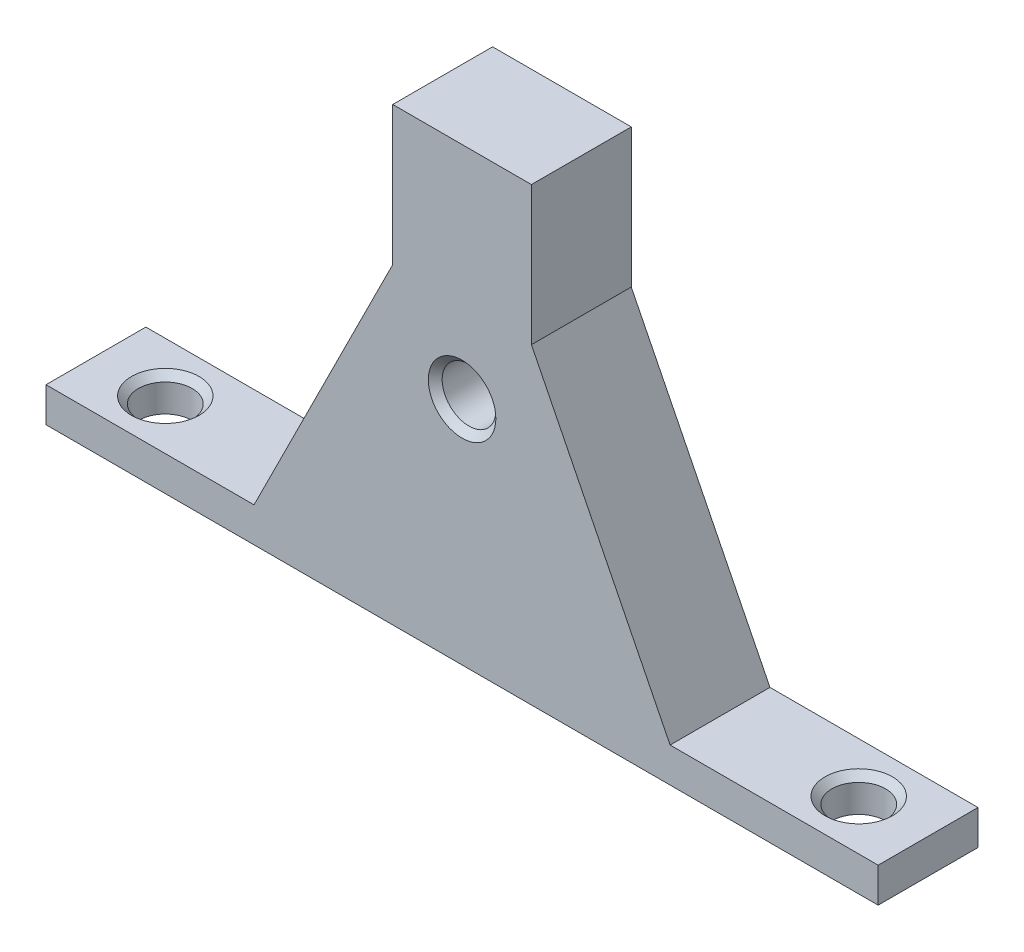
ISO-10303-21;
HEADER;
FILE_DESCRIPTION(('STEP AP214'),'2;1');
FILE_NAME('part.step','',(''),(''),'','','');
FILE_SCHEMA(('AUTOMOTIVE_DESIGN { 1 0 10303 214 1 1 1 1 }'));
ENDSEC;
DATA;
#1=APPLICATION_CONTEXT('core data for automotive mechanical design processes');
#2=APPLICATION_PROTOCOL_DEFINITION('international standard','automotive_design',2000,#1);
#3=PRODUCT_CONTEXT('',#1,'mechanical');
#4=PRODUCT('Part','Part','',(#3));
#5=PRODUCT_RELATED_PRODUCT_CATEGORY('part','',(#4));
#6=PRODUCT_DEFINITION_FORMATION('','',#4);
#7=PRODUCT_DEFINITION_CONTEXT('part definition',#1,'design');
#8=PRODUCT_DEFINITION('design','',#6,#7);
#9=PRODUCT_DEFINITION_SHAPE('','',#8);
#10=(LENGTH_UNIT() NAMED_UNIT(*) SI_UNIT(.MILLI.,.METRE.));
#11=(NAMED_UNIT(*) PLANE_ANGLE_UNIT() SI_UNIT($,.RADIAN.));
#12=(NAMED_UNIT(*) SI_UNIT($,.STERADIAN.) SOLID_ANGLE_UNIT());
#13=UNCERTAINTY_MEASURE_WITH_UNIT(LENGTH_MEASURE(1.E-05),#10,'distance_accuracy_value','');
#14=(GEOMETRIC_REPRESENTATION_CONTEXT(3) GLOBAL_UNCERTAINTY_ASSIGNED_CONTEXT((#13)) GLOBAL_UNIT_ASSIGNED_CONTEXT((#10,
#11,#12)) REPRESENTATION_CONTEXT('',''));
#15=CARTESIAN_POINT('',(0.,0.,0.));
#16=DIRECTION('',(0.,0.,1.));
#17=DIRECTION('',(1.,0.,0.));
#18=AXIS2_PLACEMENT_3D('',#15,#16,#17);
#19=CARTESIAN_POINT('',(0.,3.175,0.));
#20=DIRECTION('',(0.,-1.,0.));
#21=DIRECTION('',(0.,0.,-1.));
#22=AXIS2_PLACEMENT_3D('',#19,#20,#21);
#23=PLANE('',#22);
#24=CARTESIAN_POINT('',(-31.75,3.175,0.));
#25=DIRECTION('',(0.,1.,0.));
#26=DIRECTION('',(0.,0.,1.));
#27=AXIS2_PLACEMENT_3D('',#24,#25,#26);
#28=CIRCLE('',#27,3.09245);
#29=CARTESIAN_POINT('',(-31.75,3.175,3.09245));
#30=VERTEX_POINT('',#29);
#31=EDGE_CURVE('E187',#30,#30,#28,.T.);
#32=ORIENTED_EDGE('',*,*,#31,.F.);
#33=EDGE_LOOP('',(#32));
#34=FACE_BOUND('',#33,.T.);
#35=DIRECTION('',(0.,0.,1.));
#36=VECTOR('',#35,1.);
#37=CARTESIAN_POINT('',(-19.05,3.175,-58.453536726415));
#38=LINE('',#37,#36);
#39=CARTESIAN_POINT('',(-19.05,3.175,-4.572));
#40=VERTEX_POINT('',#39);
#41=CARTESIAN_POINT('',(-19.05,3.175,4.572));
#42=VERTEX_POINT('',#41);
#43=EDGE_CURVE('E171',#40,#42,#38,.T.);
#44=ORIENTED_EDGE('',*,*,#43,.F.);
#45=DIRECTION('',(-1.,0.,0.));
#46=VECTOR('',#45,1.);
#47=CARTESIAN_POINT('',(-38.1,3.175,-4.572));
#48=LINE('',#47,#46);
#49=CARTESIAN_POINT('',(-38.1,3.175,-4.572));
#50=VERTEX_POINT('',#49);
#51=EDGE_CURVE('E215',#40,#50,#48,.T.);
#52=ORIENTED_EDGE('',*,*,#51,.T.);
#53=DIRECTION('',(0.,0.,1.));
#54=VECTOR('',#53,1.);
#55=CARTESIAN_POINT('',(-38.1,3.175,4.572));
#56=LINE('',#55,#54);
#57=CARTESIAN_POINT('',(-38.1,3.175,4.572));
#58=VERTEX_POINT('',#57);
#59=EDGE_CURVE('E218',#50,#58,#56,.T.);
#60=ORIENTED_EDGE('',*,*,#59,.T.);
#61=DIRECTION('',(1.,0.,0.));
#62=VECTOR('',#61,1.);
#63=CARTESIAN_POINT('',(-38.1,3.175,4.572));
#64=LINE('',#63,#62);
#65=EDGE_CURVE('E221',#58,#42,#64,.T.);
#66=ORIENTED_EDGE('',*,*,#65,.T.);
#67=EDGE_LOOP('',(#44,#52,#60,#66));
#68=FACE_BOUND('',#67,.T.);
#69=ADVANCED_FACE('F42',(#34,#68),#23,.F.);
#70=CARTESIAN_POINT('',(38.1,3.175,4.572));
#71=DIRECTION('',(-1.,0.,0.));
#72=DIRECTION('',(0.,0.,1.));
#73=AXIS2_PLACEMENT_3D('',#70,#71,#72);
#74=PLANE('',#73);
#75=DIRECTION('',(0.,0.,-1.));
#76=VECTOR('',#75,1.);
#77=CARTESIAN_POINT('',(38.1,0.,4.572));
#78=LINE('',#77,#76);
#79=CARTESIAN_POINT('',(38.1,0.,4.572));
#80=VERTEX_POINT('',#79);
#81=CARTESIAN_POINT('',(38.1,0.,-4.572));
#82=VERTEX_POINT('',#81);
#83=EDGE_CURVE('E211',#80,#82,#78,.T.);
#84=ORIENTED_EDGE('',*,*,#83,.T.);
#85=DIRECTION('',(0.,-1.,0.));
#86=VECTOR('',#85,1.);
#87=CARTESIAN_POINT('',(38.1,3.175,-4.572));
#88=LINE('',#87,#86);
#89=CARTESIAN_POINT('',(38.1,3.175,-4.572));
#90=VERTEX_POINT('',#89);
#91=EDGE_CURVE('E11',#90,#82,#88,.T.);
#92=ORIENTED_EDGE('',*,*,#91,.F.);
#93=DIRECTION('',(0.,0.,-1.));
#94=VECTOR('',#93,1.);
#95=CARTESIAN_POINT('',(38.1,3.175,4.572));
#96=LINE('',#95,#94);
#97=CARTESIAN_POINT('',(38.1,3.175,4.572));
#98=VERTEX_POINT('',#97);
#99=EDGE_CURVE('E212',#98,#90,#96,.T.);
#100=ORIENTED_EDGE('',*,*,#99,.F.);
#101=DIRECTION('',(0.,-1.,0.));
#102=VECTOR('',#101,1.);
#103=CARTESIAN_POINT('',(38.1,3.175,4.572));
#104=LINE('',#103,#102);
#105=EDGE_CURVE('E225',#98,#80,#104,.T.);
#106=ORIENTED_EDGE('',*,*,#105,.T.);
#107=EDGE_LOOP('',(#84,#92,#100,#106));
#108=FACE_BOUND('',#107,.T.);
#109=ADVANCED_FACE('F44',(#108),#74,.F.);
#110=CARTESIAN_POINT('',(-38.1,3.175,-4.572));
#111=DIRECTION('',(0.,0.,1.));
#112=DIRECTION('',(1.,0.,0.));
#113=AXIS2_PLACEMENT_3D('',#110,#111,#112);
#114=PLANE('',#113);
#115=CARTESIAN_POINT('',(0.,21.082,-4.572));
#116=DIRECTION('',(0.,0.,1.));
#117=DIRECTION('',(1.,0.,0.));
#118=AXIS2_PLACEMENT_3D('',#115,#116,#117);
#119=CIRCLE('',#118,2.45745);
#120=CARTESIAN_POINT('',(2.45745,21.082,-4.572));
#121=VERTEX_POINT('',#120);
#122=EDGE_CURVE('E150',#121,#121,#119,.T.);
#123=ORIENTED_EDGE('',*,*,#122,.T.);
#124=EDGE_LOOP('',(#123));
#125=FACE_BOUND('',#124,.T.);
#126=DIRECTION('',(-1.,0.,0.));
#127=VECTOR('',#126,1.);
#128=CARTESIAN_POINT('',(-38.1,0.,-4.572));
#129=LINE('',#128,#127);
#130=CARTESIAN_POINT('',(-38.1,0.,-4.572));
#131=VERTEX_POINT('',#130);
#132=EDGE_CURVE('E229',#82,#131,#129,.T.);
#133=ORIENTED_EDGE('',*,*,#132,.T.);
#134=DIRECTION('',(0.,-1.,0.));
#135=VECTOR('',#134,1.);
#136=CARTESIAN_POINT('',(-38.1,3.175,-4.572));
#137=LINE('',#136,#135);
#138=EDGE_CURVE('E51',#50,#131,#137,.T.);
#139=ORIENTED_EDGE('',*,*,#138,.F.);
#140=ORIENTED_EDGE('',*,*,#51,.F.);
#141=DIRECTION('',(-0.447213595499958,-0.894427190999916,0.));
#142=VECTOR('',#141,1.);
#143=CARTESIAN_POINT('',(-16.51,8.255,-4.572));
#144=LINE('',#143,#142);
#145=CARTESIAN_POINT('',(-6.35,28.575,-4.572));
#146=VERTEX_POINT('',#145);
#147=EDGE_CURVE('E158',#146,#40,#144,.T.);
#148=ORIENTED_EDGE('',*,*,#147,.F.);
#149=DIRECTION('',(0.,-1.,0.));
#150=VECTOR('',#149,1.);
#151=CARTESIAN_POINT('',(-6.35,0.,-4.572));
#152=LINE('',#151,#150);
#153=CARTESIAN_POINT('',(-6.35,41.275,-4.572));
#154=VERTEX_POINT('',#153);
#155=EDGE_CURVE('E303',#154,#146,#152,.T.);
#156=ORIENTED_EDGE('',*,*,#155,.F.);
#157=DIRECTION('',(-1.,0.,0.));
#158=VECTOR('',#157,1.);
#159=CARTESIAN_POINT('',(0.,41.275,-4.572));
#160=LINE('',#159,#158);
#161=CARTESIAN_POINT('',(6.35,41.275,-4.572));
#162=VERTEX_POINT('',#161);
#163=EDGE_CURVE('E306',#162,#154,#160,.T.);
#164=ORIENTED_EDGE('',*,*,#163,.F.);
#165=DIRECTION('',(0.,-1.,0.));
#166=VECTOR('',#165,1.);
#167=CARTESIAN_POINT('',(6.35000000000004,0.,-4.572));
#168=LINE('',#167,#166);
#169=CARTESIAN_POINT('',(6.35000000000001,28.575,-4.572));
#170=VERTEX_POINT('',#169);
#171=EDGE_CURVE('E174',#162,#170,#168,.T.);
#172=ORIENTED_EDGE('',*,*,#171,.T.);
#173=DIRECTION('',(0.447213595499959,-0.894427190999915,0.));
#174=VECTOR('',#173,1.);
#175=CARTESIAN_POINT('',(16.51,8.25500000000003,-4.572));
#176=LINE('',#175,#174);
#177=CARTESIAN_POINT('',(19.0500000000001,3.175,-4.572));
#178=VERTEX_POINT('',#177);
#179=EDGE_CURVE('E132',#170,#178,#176,.T.);
#180=ORIENTED_EDGE('',*,*,#179,.T.);
#181=EDGE_CURVE('E95',#90,#178,#48,.T.);
#182=ORIENTED_EDGE('',*,*,#181,.F.);
#183=ORIENTED_EDGE('',*,*,#91,.T.);
#184=EDGE_LOOP('',(#133,#139,#140,#148,#156,#164,#172,#180,#182,#183));
#185=FACE_BOUND('',#184,.T.);
#186=ADVANCED_FACE('F277',(#125,#185),#114,.F.);
#187=CARTESIAN_POINT('',(-38.1,3.175,4.572));
#188=DIRECTION('',(1.,0.,0.));
#189=DIRECTION('',(0.,0.,-1.));
#190=AXIS2_PLACEMENT_3D('',#187,#188,#189);
#191=PLANE('',#190);
#192=DIRECTION('',(0.,0.,1.));
#193=VECTOR('',#192,1.);
#194=CARTESIAN_POINT('',(-38.1,0.,4.572));
#195=LINE('',#194,#193);
#196=CARTESIAN_POINT('',(-38.1,0.,4.572));
#197=VERTEX_POINT('',#196);
#198=EDGE_CURVE('E232',#131,#197,#195,.T.);
#199=ORIENTED_EDGE('',*,*,#198,.T.);
#200=DIRECTION('',(0.,-1.,0.));
#201=VECTOR('',#200,1.);
#202=CARTESIAN_POINT('',(-38.1,3.175,4.572));
#203=LINE('',#202,#201);
#204=EDGE_CURVE('E239',#58,#197,#203,.T.);
#205=ORIENTED_EDGE('',*,*,#204,.F.);
#206=ORIENTED_EDGE('',*,*,#59,.F.);
#207=ORIENTED_EDGE('',*,*,#138,.T.);
#208=EDGE_LOOP('',(#199,#205,#206,#207));
#209=FACE_BOUND('',#208,.T.);
#210=ADVANCED_FACE('F248',(#209),#191,.F.);
#211=CARTESIAN_POINT('',(-38.1,3.175,4.572));
#212=DIRECTION('',(0.,0.,-1.));
#213=DIRECTION('',(-1.,0.,0.));
#214=AXIS2_PLACEMENT_3D('',#211,#212,#213);
#215=PLANE('',#214);
#216=CARTESIAN_POINT('',(0.,21.082,4.572));
#217=DIRECTION('',(0.,0.,1.));
#218=DIRECTION('',(1.,0.,0.));
#219=AXIS2_PLACEMENT_3D('',#216,#217,#218);
#220=CIRCLE('',#219,3.09245);
#221=CARTESIAN_POINT('',(3.09245,21.082,4.572));
#222=VERTEX_POINT('',#221);
#223=EDGE_CURVE('E327',#222,#222,#220,.T.);
#224=ORIENTED_EDGE('',*,*,#223,.F.);
#225=EDGE_LOOP('',(#224));
#226=FACE_BOUND('',#225,.T.);
#227=DIRECTION('',(1.,0.,0.));
#228=VECTOR('',#227,1.);
#229=CARTESIAN_POINT('',(-38.1,0.,4.572));
#230=LINE('',#229,#228);
#231=EDGE_CURVE('E88',#197,#80,#230,.T.);
#232=ORIENTED_EDGE('',*,*,#231,.T.);
#233=ORIENTED_EDGE('',*,*,#105,.F.);
#234=CARTESIAN_POINT('',(19.05,3.175,4.572));
#235=VERTEX_POINT('',#234);
#236=EDGE_CURVE('E66',#235,#98,#64,.T.);
#237=ORIENTED_EDGE('',*,*,#236,.F.);
#238=DIRECTION('',(-0.447213595499959,0.894427190999915,0.));
#239=VECTOR('',#238,1.);
#240=CARTESIAN_POINT('',(16.51,8.25500000000003,4.572));
#241=LINE('',#240,#239);
#242=CARTESIAN_POINT('',(6.35000000000001,28.575,4.572));
#243=VERTEX_POINT('',#242);
#244=EDGE_CURVE('E58',#235,#243,#241,.T.);
#245=ORIENTED_EDGE('',*,*,#244,.T.);
#246=DIRECTION('',(0.,1.,0.));
#247=VECTOR('',#246,1.);
#248=CARTESIAN_POINT('',(6.35000000000004,0.,4.572));
#249=LINE('',#248,#247);
#250=CARTESIAN_POINT('',(6.35,41.275,4.572));
#251=VERTEX_POINT('',#250);
#252=EDGE_CURVE('E140',#243,#251,#249,.T.);
#253=ORIENTED_EDGE('',*,*,#252,.T.);
#254=DIRECTION('',(1.,0.,0.));
#255=VECTOR('',#254,1.);
#256=CARTESIAN_POINT('',(0.,41.275,4.572));
#257=LINE('',#256,#255);
#258=CARTESIAN_POINT('',(-6.35,41.275,4.572));
#259=VERTEX_POINT('',#258);
#260=EDGE_CURVE('E146',#259,#251,#257,.T.);
#261=ORIENTED_EDGE('',*,*,#260,.F.);
#262=DIRECTION('',(0.,1.,0.));
#263=VECTOR('',#262,1.);
#264=CARTESIAN_POINT('',(-6.35,0.,4.572));
#265=LINE('',#264,#263);
#266=CARTESIAN_POINT('',(-6.35,28.575,4.572));
#267=VERTEX_POINT('',#266);
#268=EDGE_CURVE('E163',#267,#259,#265,.T.);
#269=ORIENTED_EDGE('',*,*,#268,.F.);
#270=DIRECTION('',(0.447213595499958,0.894427190999916,0.));
#271=VECTOR('',#270,1.);
#272=CARTESIAN_POINT('',(-16.51,8.255,4.572));
#273=LINE('',#272,#271);
#274=EDGE_CURVE('E167',#42,#267,#273,.T.);
#275=ORIENTED_EDGE('',*,*,#274,.F.);
#276=ORIENTED_EDGE('',*,*,#65,.F.);
#277=ORIENTED_EDGE('',*,*,#204,.T.);
#278=EDGE_LOOP('',(#232,#233,#237,#245,#253,#261,#269,#275,#276,#277));
#279=FACE_BOUND('',#278,.T.);
#280=ADVANCED_FACE('F148',(#226,#279),#215,.F.);
#281=CARTESIAN_POINT('',(31.75,3.175,0.));
#282=DIRECTION('',(0.,1.,0.));
#283=DIRECTION('',(0.,0.,1.));
#284=AXIS2_PLACEMENT_3D('',#281,#282,#283);
#285=CIRCLE('',#284,3.09245);
#286=CARTESIAN_POINT('',(31.75,3.175,3.09245));
#287=VERTEX_POINT('',#286);
#288=EDGE_CURVE('E199',#287,#287,#285,.T.);
#289=ORIENTED_EDGE('',*,*,#288,.F.);
#290=EDGE_LOOP('',(#289));
#291=FACE_BOUND('',#290,.T.);
#292=ORIENTED_EDGE('',*,*,#181,.T.);
#293=DIRECTION('',(0.,0.,1.));
#294=VECTOR('',#293,1.);
#295=CARTESIAN_POINT('',(19.0500000000001,3.175,-58.453536726415));
#296=LINE('',#295,#294);
#297=EDGE_CURVE('E137',#178,#235,#296,.T.);
#298=ORIENTED_EDGE('',*,*,#297,.T.);
#299=ORIENTED_EDGE('',*,*,#236,.T.);
#300=ORIENTED_EDGE('',*,*,#99,.T.);
#301=EDGE_LOOP('',(#292,#298,#299,#300));
#302=FACE_BOUND('',#301,.T.);
#303=ADVANCED_FACE('F257',(#291,#302),#23,.F.);
#304=CARTESIAN_POINT('',(0.,0.,0.));
#305=DIRECTION('',(0.,-1.,0.));
#306=DIRECTION('',(0.,0.,-1.));
#307=AXIS2_PLACEMENT_3D('',#304,#305,#306);
#308=PLANE('',#307);
#309=CARTESIAN_POINT('',(-31.75,0.,0.));
#310=DIRECTION('',(0.,1.,0.));
#311=DIRECTION('',(0.,0.,1.));
#312=AXIS2_PLACEMENT_3D('',#309,#310,#311);
#313=CIRCLE('',#312,2.45745);
#314=CARTESIAN_POINT('',(-31.75,0.,2.45745));
#315=VERTEX_POINT('',#314);
#316=EDGE_CURVE('E195',#315,#315,#313,.T.);
#317=ORIENTED_EDGE('',*,*,#316,.T.);
#318=EDGE_LOOP('',(#317));
#319=FACE_BOUND('',#318,.T.);
#320=CARTESIAN_POINT('',(31.75,0.,0.));
#321=DIRECTION('',(0.,1.,0.));
#322=DIRECTION('',(0.,0.,1.));
#323=AXIS2_PLACEMENT_3D('',#320,#321,#322);
#324=CIRCLE('',#323,2.45745);
#325=CARTESIAN_POINT('',(31.75,0.,2.45745));
#326=VERTEX_POINT('',#325);
#327=EDGE_CURVE('E207',#326,#326,#324,.T.);
#328=ORIENTED_EDGE('',*,*,#327,.T.);
#329=EDGE_LOOP('',(#328));
#330=FACE_BOUND('',#329,.T.);
#331=ORIENTED_EDGE('',*,*,#83,.F.);
#332=ORIENTED_EDGE('',*,*,#231,.F.);
#333=ORIENTED_EDGE('',*,*,#198,.F.);
#334=ORIENTED_EDGE('',*,*,#132,.F.);
#335=EDGE_LOOP('',(#331,#332,#333,#334));
#336=FACE_BOUND('',#335,.T.);
#337=ADVANCED_FACE('F253',(#319,#330,#336),#308,.T.);
#338=CARTESIAN_POINT('',(31.75,3.175,0.));
#339=DIRECTION('',(0.,1.,0.));
#340=DIRECTION('',(0.,0.,1.));
#341=AXIS2_PLACEMENT_3D('',#338,#339,#340);
#342=CYLINDRICAL_SURFACE('',#341,2.45744999999999);
#343=ORIENTED_EDGE('',*,*,#327,.F.);
#344=EDGE_LOOP('',(#343));
#345=FACE_BOUND('',#344,.T.);
#346=CARTESIAN_POINT('',(31.75,2.53999999999999,0.));
#347=DIRECTION('',(0.,1.,0.));
#348=DIRECTION('',(0.,0.,1.));
#349=AXIS2_PLACEMENT_3D('',#346,#347,#348);
#350=CIRCLE('',#349,2.45744999999999);
#351=CARTESIAN_POINT('',(31.75,2.53999999999999,2.45744999999999));
#352=VERTEX_POINT('',#351);
#353=EDGE_CURVE('E203',#352,#352,#350,.T.);
#354=ORIENTED_EDGE('',*,*,#353,.T.);
#355=EDGE_LOOP('',(#354));
#356=FACE_BOUND('',#355,.T.);
#357=ADVANCED_FACE('F265',(#345,#356),#342,.F.);
#358=CARTESIAN_POINT('',(31.75,3.175,0.));
#359=DIRECTION('',(0.,1.,0.));
#360=DIRECTION('',(0.,0.,1.));
#361=AXIS2_PLACEMENT_3D('',#358,#359,#360);
#362=CONICAL_SURFACE('',#361,3.09245,0.785398163397447);
#363=ORIENTED_EDGE('',*,*,#353,.F.);
#364=EDGE_LOOP('',(#363));
#365=FACE_BOUND('',#364,.T.);
#366=ORIENTED_EDGE('',*,*,#288,.T.);
#367=EDGE_LOOP('',(#366));
#368=FACE_BOUND('',#367,.T.);
#369=ADVANCED_FACE('F367',(#365,#368),#362,.F.);
#370=CARTESIAN_POINT('',(-31.75,3.175,0.));
#371=DIRECTION('',(0.,1.,0.));
#372=DIRECTION('',(0.,0.,1.));
#373=AXIS2_PLACEMENT_3D('',#370,#371,#372);
#374=CYLINDRICAL_SURFACE('',#373,2.45744999999999);
#375=ORIENTED_EDGE('',*,*,#316,.F.);
#376=EDGE_LOOP('',(#375));
#377=FACE_BOUND('',#376,.T.);
#378=CARTESIAN_POINT('',(-31.75,2.53999999999999,0.));
#379=DIRECTION('',(0.,1.,0.));
#380=DIRECTION('',(0.,0.,1.));
#381=AXIS2_PLACEMENT_3D('',#378,#379,#380);
#382=CIRCLE('',#381,2.45744999999999);
#383=CARTESIAN_POINT('',(-31.75,2.53999999999999,2.45744999999999));
#384=VERTEX_POINT('',#383);
#385=EDGE_CURVE('E191',#384,#384,#382,.T.);
#386=ORIENTED_EDGE('',*,*,#385,.T.);
#387=EDGE_LOOP('',(#386));
#388=FACE_BOUND('',#387,.T.);
#389=ADVANCED_FACE('F363',(#377,#388),#374,.F.);
#390=CARTESIAN_POINT('',(-31.75,3.175,0.));
#391=DIRECTION('',(0.,1.,0.));
#392=DIRECTION('',(0.,0.,1.));
#393=AXIS2_PLACEMENT_3D('',#390,#391,#392);
#394=CONICAL_SURFACE('',#393,3.09245,0.78539816339745);
#395=ORIENTED_EDGE('',*,*,#385,.F.);
#396=EDGE_LOOP('',(#395));
#397=FACE_BOUND('',#396,.T.);
#398=ORIENTED_EDGE('',*,*,#31,.T.);
#399=EDGE_LOOP('',(#398));
#400=FACE_BOUND('',#399,.T.);
#401=ADVANCED_FACE('F349',(#397,#400),#394,.F.);
#402=CARTESIAN_POINT('',(-16.51,8.255,-58.453536726415));
#403=DIRECTION('',(0.894427190999916,-0.447213595499958,0.));
#404=DIRECTION('',(0.447213595499958,0.894427190999916,0.));
#405=AXIS2_PLACEMENT_3D('',#402,#403,#404);
#406=PLANE('',#405);
#407=DIRECTION('',(0.,0.,1.));
#408=VECTOR('',#407,1.);
#409=CARTESIAN_POINT('',(-6.35,28.575,-58.453536726415));
#410=LINE('',#409,#408);
#411=EDGE_CURVE('E175',#146,#267,#410,.T.);
#412=ORIENTED_EDGE('',*,*,#411,.F.);
#413=ORIENTED_EDGE('',*,*,#147,.T.);
#414=ORIENTED_EDGE('',*,*,#43,.T.);
#415=ORIENTED_EDGE('',*,*,#274,.T.);
#416=EDGE_LOOP('',(#412,#413,#414,#415));
#417=FACE_BOUND('',#416,.T.);
#418=ADVANCED_FACE('F345',(#417),#406,.F.);
#419=CARTESIAN_POINT('',(-6.35,0.,-58.453536726415));
#420=DIRECTION('',(1.,0.,0.));
#421=DIRECTION('',(0.,0.,-1.));
#422=AXIS2_PLACEMENT_3D('',#419,#420,#421);
#423=PLANE('',#422);
#424=DIRECTION('',(0.,0.,1.));
#425=VECTOR('',#424,1.);
#426=CARTESIAN_POINT('',(-6.35,41.275,-58.453536726415));
#427=LINE('',#426,#425);
#428=EDGE_CURVE('E178',#154,#259,#427,.T.);
#429=ORIENTED_EDGE('',*,*,#428,.F.);
#430=ORIENTED_EDGE('',*,*,#155,.T.);
#431=ORIENTED_EDGE('',*,*,#411,.T.);
#432=ORIENTED_EDGE('',*,*,#268,.T.);
#433=EDGE_LOOP('',(#429,#430,#431,#432));
#434=FACE_BOUND('',#433,.T.);
#435=ADVANCED_FACE('F348',(#434),#423,.F.);
#436=CARTESIAN_POINT('',(0.,41.275,-58.453536726415));
#437=DIRECTION('',(0.,-1.,0.));
#438=DIRECTION('',(1.,0.,0.));
#439=AXIS2_PLACEMENT_3D('',#436,#437,#438);
#440=PLANE('',#439);
#441=DIRECTION('',(0.,0.,1.));
#442=VECTOR('',#441,1.);
#443=CARTESIAN_POINT('',(6.35,41.275,-58.453536726415));
#444=LINE('',#443,#442);
#445=EDGE_CURVE('E136',#162,#251,#444,.T.);
#446=ORIENTED_EDGE('',*,*,#445,.F.);
#447=ORIENTED_EDGE('',*,*,#163,.T.);
#448=ORIENTED_EDGE('',*,*,#428,.T.);
#449=ORIENTED_EDGE('',*,*,#260,.T.);
#450=EDGE_LOOP('',(#446,#447,#448,#449));
#451=FACE_BOUND('',#450,.T.);
#452=ADVANCED_FACE('F352',(#451),#440,.F.);
#453=CARTESIAN_POINT('',(6.35000000000004,0.,-58.453536726415));
#454=DIRECTION('',(1.,0.,0.));
#455=DIRECTION('',(0.,1.,0.));
#456=AXIS2_PLACEMENT_3D('',#453,#454,#455);
#457=PLANE('',#456);
#458=ORIENTED_EDGE('',*,*,#171,.F.);
#459=ORIENTED_EDGE('',*,*,#445,.T.);
#460=ORIENTED_EDGE('',*,*,#252,.F.);
#461=DIRECTION('',(0.,0.,1.));
#462=VECTOR('',#461,1.);
#463=CARTESIAN_POINT('',(6.35000000000001,28.575,-58.453536726415));
#464=LINE('',#463,#462);
#465=EDGE_CURVE('E129',#170,#243,#464,.T.);
#466=ORIENTED_EDGE('',*,*,#465,.F.);
#467=EDGE_LOOP('',(#458,#459,#460,#466));
#468=FACE_BOUND('',#467,.T.);
#469=ADVANCED_FACE('F141',(#468),#457,.T.);
#470=CARTESIAN_POINT('',(16.51,8.25500000000003,-58.453536726415));
#471=DIRECTION('',(0.894427190999915,0.447213595499959,0.));
#472=DIRECTION('',(-0.447213595499959,0.894427190999915,0.));
#473=AXIS2_PLACEMENT_3D('',#470,#471,#472);
#474=PLANE('',#473);
#475=ORIENTED_EDGE('',*,*,#179,.F.);
#476=ORIENTED_EDGE('',*,*,#465,.T.);
#477=ORIENTED_EDGE('',*,*,#244,.F.);
#478=ORIENTED_EDGE('',*,*,#297,.F.);
#479=EDGE_LOOP('',(#475,#476,#477,#478));
#480=FACE_BOUND('',#479,.T.);
#481=ADVANCED_FACE('F131',(#480),#474,.T.);
#482=CARTESIAN_POINT('',(0.,21.082,4.572));
#483=DIRECTION('',(0.,0.,1.));
#484=DIRECTION('',(1.,0.,0.));
#485=AXIS2_PLACEMENT_3D('',#482,#483,#484);
#486=CYLINDRICAL_SURFACE('',#485,2.45744999999999);
#487=ORIENTED_EDGE('',*,*,#122,.F.);
#488=EDGE_LOOP('',(#487));
#489=FACE_BOUND('',#488,.T.);
#490=CARTESIAN_POINT('',(0.,21.082,3.93699999999999));
#491=DIRECTION('',(0.,0.,1.));
#492=DIRECTION('',(1.,0.,0.));
#493=AXIS2_PLACEMENT_3D('',#490,#491,#492);
#494=CIRCLE('',#493,2.45744999999999);
#495=CARTESIAN_POINT('',(2.45744999999999,21.082,3.93699999999999));
#496=VERTEX_POINT('',#495);
#497=EDGE_CURVE('E155',#496,#496,#494,.T.);
#498=ORIENTED_EDGE('',*,*,#497,.T.);
#499=EDGE_LOOP('',(#498));
#500=FACE_BOUND('',#499,.T.);
#501=ADVANCED_FACE('F335',(#489,#500),#486,.F.);
#502=CARTESIAN_POINT('',(0.,21.082,4.572));
#503=DIRECTION('',(0.,0.,1.));
#504=DIRECTION('',(1.,0.,0.));
#505=AXIS2_PLACEMENT_3D('',#502,#503,#504);
#506=CONICAL_SURFACE('',#505,3.09245,0.785398163397448);
#507=ORIENTED_EDGE('',*,*,#497,.F.);
#508=EDGE_LOOP('',(#507));
#509=FACE_BOUND('',#508,.T.);
#510=ORIENTED_EDGE('',*,*,#223,.T.);
#511=EDGE_LOOP('',(#510));
#512=FACE_BOUND('',#511,.T.);
#513=ADVANCED_FACE('F333',(#509,#512),#506,.F.);
#514=CLOSED_SHELL('',(#69,#109,#186,#210,#280,#303,#337,#357,#369,#389,#401,#418,#435,#452,#469,
#481,#501,#513));
#515=MANIFOLD_SOLID_BREP('B2',#514);
#516=ADVANCED_BREP_SHAPE_REPRESENTATION('',(#18,#515),#14);
#517=SHAPE_DEFINITION_REPRESENTATION(#9,#516);
ENDSEC;
END-ISO-10303-21;
